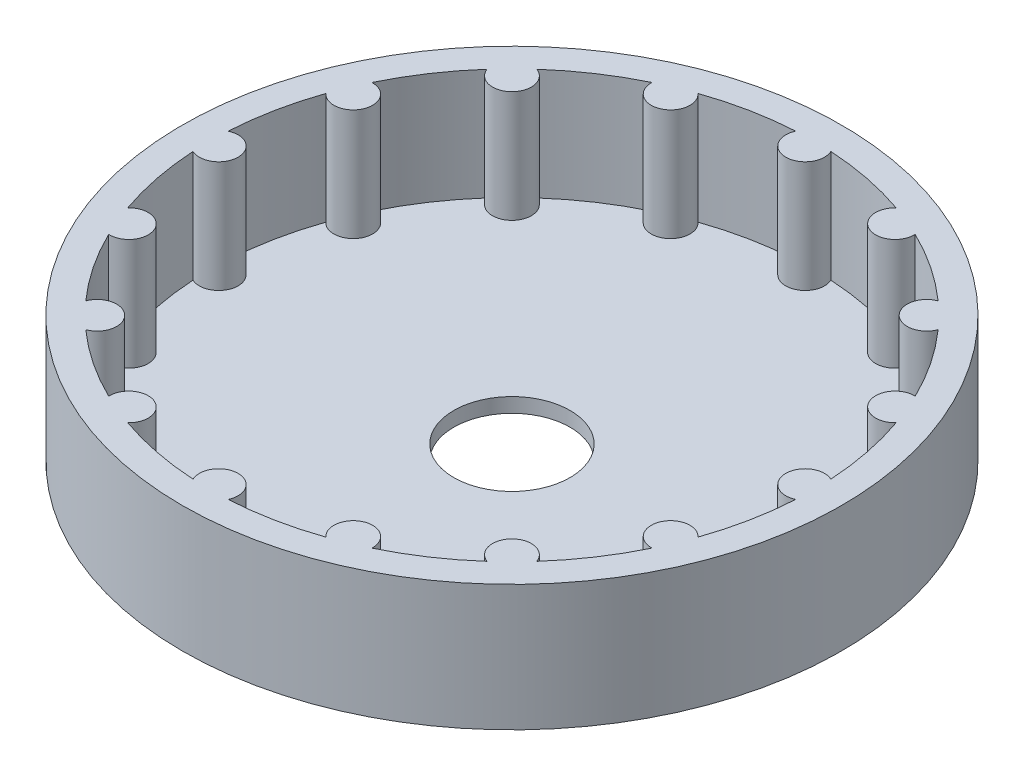
ISO-10303-21;
HEADER;
FILE_DESCRIPTION(('STEP AP214'),'2;1');
FILE_NAME('part.step','',(''),(''),'','','');
FILE_SCHEMA(('AUTOMOTIVE_DESIGN { 1 0 10303 214 1 1 1 1 }'));
ENDSEC;
DATA;
#1=APPLICATION_CONTEXT('core data for automotive mechanical design processes');
#2=APPLICATION_PROTOCOL_DEFINITION('international standard','automotive_design',2000,#1);
#3=PRODUCT_CONTEXT('',#1,'mechanical');
#4=PRODUCT('Part','Part','',(#3));
#5=PRODUCT_RELATED_PRODUCT_CATEGORY('part','',(#4));
#6=PRODUCT_DEFINITION_FORMATION('','',#4);
#7=PRODUCT_DEFINITION_CONTEXT('part definition',#1,'design');
#8=PRODUCT_DEFINITION('design','',#6,#7);
#9=PRODUCT_DEFINITION_SHAPE('','',#8);
#10=(LENGTH_UNIT() NAMED_UNIT(*) SI_UNIT(.MILLI.,.METRE.));
#11=(NAMED_UNIT(*) PLANE_ANGLE_UNIT() SI_UNIT($,.RADIAN.));
#12=(NAMED_UNIT(*) SI_UNIT($,.STERADIAN.) SOLID_ANGLE_UNIT());
#13=UNCERTAINTY_MEASURE_WITH_UNIT(LENGTH_MEASURE(1.E-05),#10,'distance_accuracy_value','');
#14=(GEOMETRIC_REPRESENTATION_CONTEXT(3) GLOBAL_UNCERTAINTY_ASSIGNED_CONTEXT((#13)) GLOBAL_UNIT_ASSIGNED_CONTEXT((#10,
#11,#12)) REPRESENTATION_CONTEXT('',''));
#15=CARTESIAN_POINT('',(0.,0.,0.));
#16=DIRECTION('',(0.,0.,1.));
#17=DIRECTION('',(1.,0.,0.));
#18=AXIS2_PLACEMENT_3D('',#15,#16,#17);
#19=CARTESIAN_POINT('',(0.,23.,-60.5));
#20=DIRECTION('',(0.,-1.,0.));
#21=DIRECTION('',(0.,0.,-1.));
#22=AXIS2_PLACEMENT_3D('',#19,#20,#21);
#23=CYLINDRICAL_SURFACE('',#22,4.);
#24=CARTESIAN_POINT('',(0.,0.,-60.5));
#25=DIRECTION('',(0.,1.,0.));
#26=DIRECTION('',(0.,0.,1.));
#27=AXIS2_PLACEMENT_3D('',#24,#25,#26);
#28=CIRCLE('',#27,4.);
#29=CARTESIAN_POINT('',(-3.63159136046996,0.,-62.1767659915921));
#30=VERTEX_POINT('',#29);
#31=CARTESIAN_POINT('',(3.63159136046996,0.,-62.1767659915921));
#32=VERTEX_POINT('',#31);
#33=EDGE_CURVE('E585',#30,#32,#28,.T.);
#34=ORIENTED_EDGE('',*,*,#33,.T.);
#35=DIRECTION('',(0.,-1.,0.));
#36=VECTOR('',#35,1.);
#37=CARTESIAN_POINT('',(3.63159136046996,23.,-62.1767659915921));
#38=LINE('',#37,#36);
#39=CARTESIAN_POINT('',(3.63159136046996,23.,-62.1767659915921));
#40=VERTEX_POINT('',#39);
#41=EDGE_CURVE('E12',#40,#32,#38,.T.);
#42=ORIENTED_EDGE('',*,*,#41,.F.);
#43=CARTESIAN_POINT('',(0.,23.,-60.5));
#44=DIRECTION('',(0.,1.,0.));
#45=DIRECTION('',(0.,0.,1.));
#46=AXIS2_PLACEMENT_3D('',#43,#44,#45);
#47=CIRCLE('',#46,4.);
#48=CARTESIAN_POINT('',(-3.63159136046996,23.,-62.1767659915921));
#49=VERTEX_POINT('',#48);
#50=EDGE_CURVE('E581',#49,#40,#47,.T.);
#51=ORIENTED_EDGE('',*,*,#50,.F.);
#52=DIRECTION('',(0.,-1.,0.));
#53=VECTOR('',#52,1.);
#54=CARTESIAN_POINT('',(-3.63159136046996,23.,-62.1767659915921));
#55=LINE('',#54,#53);
#56=EDGE_CURVE('E178',#49,#30,#55,.T.);
#57=ORIENTED_EDGE('',*,*,#56,.T.);
#58=EDGE_LOOP('',(#34,#42,#51,#57));
#59=FACE_BOUND('',#58,.T.);
#60=ADVANCED_FACE('F167',(#59),#23,.T.);
#61=CARTESIAN_POINT('',(0.,23.,0.));
#62=DIRECTION('',(0.,1.,0.));
#63=DIRECTION('',(0.,0.,1.));
#64=AXIS2_PLACEMENT_3D('',#61,#62,#63);
#65=PLANE('',#64);
#66=ORIENTED_EDGE('',*,*,#50,.T.);
#67=CARTESIAN_POINT('',(0.,23.,0.));
#68=DIRECTION('',(0.,1.,0.));
#69=DIRECTION('',(0.,0.,1.));
#70=AXIS2_PLACEMENT_3D('',#67,#68,#69);
#71=CIRCLE('',#70,62.2827318362213);
#72=CARTESIAN_POINT('',(20.4388652946379,23.,-58.8335913441488));
#73=VERTEX_POINT('',#72);
#74=EDGE_CURVE('E621',#73,#40,#71,.T.);
#75=ORIENTED_EDGE('',*,*,#74,.F.);
#76=CARTESIAN_POINT('',(23.1523476580888,23.,-55.8947117169375));
#77=DIRECTION('',(0.,1.,0.));
#78=DIRECTION('',(0.,0.,1.));
#79=AXIS2_PLACEMENT_3D('',#76,#77,#78);
#80=CIRCLE('',#79,3.99999999999961);
#81=CARTESIAN_POINT('',(27.1491711514072,23.,-56.0540916506034));
#82=VERTEX_POINT('',#81);
#83=EDGE_CURVE('E557',#73,#82,#80,.T.);
#84=ORIENTED_EDGE('',*,*,#83,.T.);
#85=CARTESIAN_POINT('',(41.3976899874106,23.,-46.5335357423965));
#86=VERTEX_POINT('',#85);
#87=EDGE_CURVE('E617',#86,#82,#71,.T.);
#88=ORIENTED_EDGE('',*,*,#87,.F.);
#89=CARTESIAN_POINT('',(42.7799602617896,23.,-42.7799602617946));
#90=DIRECTION('',(0.,1.,0.));
#91=DIRECTION('',(0.,0.,1.));
#92=AXIS2_PLACEMENT_3D('',#89,#90,#91);
#93=CIRCLE('',#92,4.00000000000098);
#94=CARTESIAN_POINT('',(46.5335357423917,23.,-41.397689987416));
#95=VERTEX_POINT('',#94);
#96=EDGE_CURVE('E550',#86,#95,#93,.T.);
#97=ORIENTED_EDGE('',*,*,#96,.T.);
#98=CARTESIAN_POINT('',(56.0540916505962,23.,-27.1491711514222));
#99=VERTEX_POINT('',#98);
#100=EDGE_CURVE('E612',#99,#95,#71,.T.);
#101=ORIENTED_EDGE('',*,*,#100,.F.);
#102=CARTESIAN_POINT('',(55.8947117169403,23.,-23.152347658099));
#103=DIRECTION('',(0.,1.,0.));
#104=DIRECTION('',(0.,0.,1.));
#105=AXIS2_PLACEMENT_3D('',#102,#103,#104);
#106=CIRCLE('',#105,4.00000000000401);
#107=CARTESIAN_POINT('',(58.8335913441486,23.,-20.4388652946384));
#108=VERTEX_POINT('',#107);
#109=EDGE_CURVE('E542',#99,#108,#106,.T.);
#110=ORIENTED_EDGE('',*,*,#109,.T.);
#111=CARTESIAN_POINT('',(62.1767659915905,23.,-3.63159136049729));
#112=VERTEX_POINT('',#111);
#113=EDGE_CURVE('E607',#112,#108,#71,.T.);
#114=ORIENTED_EDGE('',*,*,#113,.F.);
#115=CARTESIAN_POINT('',(60.500000000012,23.,-1.20254802740738E-11));
#116=DIRECTION('',(0.,1.,0.));
#117=DIRECTION('',(0.,0.,1.));
#118=AXIS2_PLACEMENT_3D('',#115,#116,#117);
#119=CIRCLE('',#118,4.00000000000819);
#120=CARTESIAN_POINT('',(62.176765991592,23.,3.63159136047257));
#121=VERTEX_POINT('',#120);
#122=EDGE_CURVE('E534',#112,#121,#119,.T.);
#123=ORIENTED_EDGE('',*,*,#122,.T.);
#124=CARTESIAN_POINT('',(58.83359134416,23.,20.4388652946055));
#125=VERTEX_POINT('',#124);
#126=EDGE_CURVE('E602',#125,#121,#71,.T.);
#127=ORIENTED_EDGE('',*,*,#126,.F.);
#128=CARTESIAN_POINT('',(55.8947117169495,23.,23.1523476580768));
#129=DIRECTION('',(0.,1.,0.));
#130=DIRECTION('',(0.,0.,1.));
#131=AXIS2_PLACEMENT_3D('',#128,#129,#130);
#132=CIRCLE('',#131,4.00000000001291);
#133=CARTESIAN_POINT('',(56.0540916506025,23.,27.149171151409));
#134=VERTEX_POINT('',#133);
#135=EDGE_CURVE('E526',#125,#134,#132,.T.);
#136=ORIENTED_EDGE('',*,*,#135,.T.);
#137=CARTESIAN_POINT('',(46.5335357424206,23.,41.3976899873835));
#138=VERTEX_POINT('',#137);
#139=EDGE_CURVE('E597',#138,#134,#71,.T.);
#140=ORIENTED_EDGE('',*,*,#139,.F.);
#141=CARTESIAN_POINT('',(42.7799602618067,23.,42.7799602617776));
#142=DIRECTION('',(0.,1.,0.));
#143=DIRECTION('',(0.,0.,1.));
#144=AXIS2_PLACEMENT_3D('',#141,#142,#143);
#145=CIRCLE('',#144,4.00000000001745);
#146=CARTESIAN_POINT('',(41.3976899874151,23.,46.5335357423925));
#147=VERTEX_POINT('',#146);
#148=EDGE_CURVE('E397',#138,#147,#145,.T.);
#149=ORIENTED_EDGE('',*,*,#148,.T.);
#150=CARTESIAN_POINT('',(27.1491711514514,23.,56.054091650582));
#151=VERTEX_POINT('',#150);
#152=EDGE_CURVE('E423',#151,#147,#71,.T.);
#153=ORIENTED_EDGE('',*,*,#152,.F.);
#154=CARTESIAN_POINT('',(23.1523476581111,23.,55.8947117169282));
#155=DIRECTION('',(0.,1.,0.));
#156=DIRECTION('',(0.,0.,1.));
#157=AXIS2_PLACEMENT_3D('',#154,#155,#156);
#158=CIRCLE('',#157,4.00000000002112);
#159=CARTESIAN_POINT('',(20.4388652946383,23.,58.8335913441486));
#160=VERTEX_POINT('',#159);
#161=EDGE_CURVE('E396',#151,#160,#158,.T.);
#162=ORIENTED_EDGE('',*,*,#161,.T.);
#163=CARTESIAN_POINT('',(3.63159136052117,23.,62.1767659915891));
#164=VERTEX_POINT('',#163);
#165=EDGE_CURVE('E385',#164,#160,#71,.T.);
#166=ORIENTED_EDGE('',*,*,#165,.F.);
#167=CARTESIAN_POINT('',(2.40509605481477E-11,23.,60.5));
#168=DIRECTION('',(0.,1.,0.));
#169=DIRECTION('',(0.,0.,1.));
#170=AXIS2_PLACEMENT_3D('',#167,#168,#169);
#171=CIRCLE('',#170,4.00000000002341);
#172=CARTESIAN_POINT('',(-3.63159136047173,23.,62.176765991592));
#173=VERTEX_POINT('',#172);
#174=EDGE_CURVE('E506',#164,#173,#171,.T.);
#175=ORIENTED_EDGE('',*,*,#174,.T.);
#176=CARTESIAN_POINT('',(-20.4388652945944,23.,58.8335913441639));
#177=VERTEX_POINT('',#176);
#178=EDGE_CURVE('E421',#177,#173,#71,.T.);
#179=ORIENTED_EDGE('',*,*,#178,.F.);
#180=CARTESIAN_POINT('',(-23.1523476580648,23.,55.8947117169375));
#181=DIRECTION('',(0.,1.,0.));
#182=DIRECTION('',(0.,0.,1.));
#183=AXIS2_PLACEMENT_3D('',#180,#181,#182);
#184=CIRCLE('',#183,4.00000000002393);
#185=CARTESIAN_POINT('',(-27.1491711514075,23.,56.0540916506033));
#186=VERTEX_POINT('',#185);
#187=EDGE_CURVE('E505',#177,#186,#184,.T.);
#188=ORIENTED_EDGE('',*,*,#187,.T.);
#189=CARTESIAN_POINT('',(-41.3976899873852,23.,46.5335357424191));
#190=VERTEX_POINT('',#189);
#191=EDGE_CURVE('E495',#190,#186,#71,.T.);
#192=ORIENTED_EDGE('',*,*,#191,.F.);
#193=CARTESIAN_POINT('',(-42.7799602617656,23.,42.7799602617946));
#194=DIRECTION('',(0.,1.,0.));
#195=DIRECTION('',(0.,0.,1.));
#196=AXIS2_PLACEMENT_3D('',#193,#194,#195);
#197=CIRCLE('',#196,4.00000000002262);
#198=CARTESIAN_POINT('',(-46.533535742391,23.,41.3976899874168));
#199=VERTEX_POINT('',#198);
#200=EDGE_CURVE('E706',#190,#199,#197,.T.);
#201=ORIENTED_EDGE('',*,*,#200,.T.);
#202=CARTESIAN_POINT('',(-56.0540916505888,23.,27.1491711514373));
#203=VERTEX_POINT('',#202);
#204=EDGE_CURVE('E646',#203,#199,#71,.T.);
#205=ORIENTED_EDGE('',*,*,#204,.F.);
#206=CARTESIAN_POINT('',(-55.8947117169162,23.,23.1523476580991));
#207=DIRECTION('',(0.,1.,0.));
#208=DIRECTION('',(0.,0.,1.));
#209=AXIS2_PLACEMENT_3D('',#206,#207,#208);
#210=CIRCLE('',#209,4.00000000001976);
#211=CARTESIAN_POINT('',(-58.8335913441479,23.,20.4388652946405));
#212=VERTEX_POINT('',#211);
#213=EDGE_CURVE('E698',#203,#212,#210,.T.);
#214=ORIENTED_EDGE('',*,*,#213,.T.);
#215=CARTESIAN_POINT('',(-62.1767659915907,23.,3.63159136049431));
#216=VERTEX_POINT('',#215);
#217=EDGE_CURVE('E641',#216,#212,#71,.T.);
#218=ORIENTED_EDGE('',*,*,#217,.F.);
#219=CARTESIAN_POINT('',(-60.499999999988,23.,1.20328893872087E-11));
#220=DIRECTION('',(0.,1.,0.));
#221=DIRECTION('',(0.,0.,1.));
#222=AXIS2_PLACEMENT_3D('',#219,#220,#221);
#223=CIRCLE('',#222,4.00000000001563);
#224=CARTESIAN_POINT('',(-62.1767659915921,23.,-3.63159136046958));
#225=VERTEX_POINT('',#224);
#226=EDGE_CURVE('E690',#216,#225,#223,.T.);
#227=ORIENTED_EDGE('',*,*,#226,.T.);
#228=CARTESIAN_POINT('',(-58.8335913441527,23.,-20.4388652946265));
#229=VERTEX_POINT('',#228);
#230=EDGE_CURVE('E636',#229,#225,#71,.T.);
#231=ORIENTED_EDGE('',*,*,#230,.F.);
#232=CARTESIAN_POINT('',(-55.8947117169254,23.,-23.1523476580768));
#233=DIRECTION('',(0.,1.,0.));
#234=DIRECTION('',(0.,0.,1.));
#235=AXIS2_PLACEMENT_3D('',#232,#233,#234);
#236=CIRCLE('',#235,4.00000000001096);
#237=CARTESIAN_POINT('',(-56.054091650604,23.,-27.1491711514061));
#238=VERTEX_POINT('',#237);
#239=EDGE_CURVE('E682',#229,#238,#236,.T.);
#240=ORIENTED_EDGE('',*,*,#239,.T.);
#241=CARTESIAN_POINT('',(-46.5335357423954,23.,-41.3976899874119));
#242=VERTEX_POINT('',#241);
#243=EDGE_CURVE('E631',#242,#238,#71,.T.);
#244=ORIENTED_EDGE('',*,*,#243,.F.);
#245=CARTESIAN_POINT('',(-42.7799602617826,23.,-42.7799602617776));
#246=DIRECTION('',(0.,1.,0.));
#247=DIRECTION('',(0.,0.,1.));
#248=AXIS2_PLACEMENT_3D('',#245,#246,#247);
#249=CIRCLE('',#248,4.00000000000657);
#250=CARTESIAN_POINT('',(-41.3976899874173,23.,-46.5335357423905));
#251=VERTEX_POINT('',#250);
#252=EDGE_CURVE('E674',#242,#251,#249,.T.);
#253=ORIENTED_EDGE('',*,*,#252,.T.);
#254=CARTESIAN_POINT('',(-27.1491711514085,23.,-56.0540916506028));
#255=VERTEX_POINT('',#254);
#256=EDGE_CURVE('E628',#255,#251,#71,.T.);
#257=ORIENTED_EDGE('',*,*,#256,.F.);
#258=CARTESIAN_POINT('',(-23.1523476580871,23.,-55.8947117169282));
#259=DIRECTION('',(0.,1.,0.));
#260=DIRECTION('',(0.,0.,1.));
#261=AXIS2_PLACEMENT_3D('',#258,#259,#260);
#262=CIRCLE('',#261,4.00000000000304);
#263=CARTESIAN_POINT('',(-20.4388652946402,23.,-58.833591344148));
#264=VERTEX_POINT('',#263);
#265=EDGE_CURVE('E406',#255,#264,#262,.T.);
#266=ORIENTED_EDGE('',*,*,#265,.T.);
#267=EDGE_CURVE('E625',#49,#264,#71,.T.);
#268=ORIENTED_EDGE('',*,*,#267,.F.);
#269=EDGE_LOOP('',(#66,#75,#84,#88,#97,#101,#110,#114,#123,#127,#136,#140,#149,#153,#162,#166,
#175,#179,#188,#192,#201,#205,#214,#218,#227,#231,#240,#244,#253,#257,#266,#268));
#270=FACE_BOUND('',#269,.T.);
#271=CARTESIAN_POINT('',(0.,23.,0.));
#272=DIRECTION('',(0.,1.,0.));
#273=DIRECTION('',(0.,0.,1.));
#274=AXIS2_PLACEMENT_3D('',#271,#272,#273);
#275=CIRCLE('',#274,68.);
#276=CARTESIAN_POINT('',(0.,23.,68.));
#277=VERTEX_POINT('',#276);
#278=EDGE_CURVE('E388',#277,#277,#275,.T.);
#279=ORIENTED_EDGE('',*,*,#278,.T.);
#280=EDGE_LOOP('',(#279));
#281=FACE_BOUND('',#280,.T.);
#282=ADVANCED_FACE('F660',(#270,#281),#65,.T.);
#283=CARTESIAN_POINT('',(-23.1523476580648,23.,55.8947117169375));
#284=DIRECTION('',(0.,-1.,0.));
#285=DIRECTION('',(0.,0.,-1.));
#286=AXIS2_PLACEMENT_3D('',#283,#284,#285);
#287=CYLINDRICAL_SURFACE('',#286,4.00000000002393);
#288=ORIENTED_EDGE('',*,*,#187,.F.);
#289=DIRECTION('',(0.,-1.,0.));
#290=VECTOR('',#289,1.);
#291=CARTESIAN_POINT('',(-20.4388652945944,23.,58.8335913441639));
#292=LINE('',#291,#290);
#293=CARTESIAN_POINT('',(-20.4388652945944,0.,58.8335913441639));
#294=VERTEX_POINT('',#293);
#295=EDGE_CURVE('E500',#177,#294,#292,.T.);
#296=ORIENTED_EDGE('',*,*,#295,.T.);
#297=CARTESIAN_POINT('',(-23.1523476580648,0.,55.8947117169375));
#298=DIRECTION('',(0.,1.,0.));
#299=DIRECTION('',(0.,0.,1.));
#300=AXIS2_PLACEMENT_3D('',#297,#298,#299);
#301=CIRCLE('',#300,4.00000000002393);
#302=CARTESIAN_POINT('',(-27.1491711514075,0.,56.0540916506033));
#303=VERTEX_POINT('',#302);
#304=EDGE_CURVE('E485',#294,#303,#301,.T.);
#305=ORIENTED_EDGE('',*,*,#304,.T.);
#306=DIRECTION('',(0.,-1.,0.));
#307=VECTOR('',#306,1.);
#308=CARTESIAN_POINT('',(-27.1491711514075,23.,56.0540916506033));
#309=LINE('',#308,#307);
#310=EDGE_CURVE('E493',#186,#303,#309,.T.);
#311=ORIENTED_EDGE('',*,*,#310,.F.);
#312=EDGE_LOOP('',(#288,#296,#305,#311));
#313=FACE_BOUND('',#312,.T.);
#314=ADVANCED_FACE('F502',(#313),#287,.T.);
#315=CARTESIAN_POINT('',(-42.7799602617656,23.,42.7799602617946));
#316=DIRECTION('',(0.,-1.,0.));
#317=DIRECTION('',(0.,0.,-1.));
#318=AXIS2_PLACEMENT_3D('',#315,#316,#317);
#319=CYLINDRICAL_SURFACE('',#318,4.00000000002262);
#320=ORIENTED_EDGE('',*,*,#200,.F.);
#321=DIRECTION('',(0.,-1.,0.));
#322=VECTOR('',#321,1.);
#323=CARTESIAN_POINT('',(-41.3976899873852,23.,46.5335357424191));
#324=LINE('',#323,#322);
#325=CARTESIAN_POINT('',(-41.3976899873852,0.,46.5335357424191));
#326=VERTEX_POINT('',#325);
#327=EDGE_CURVE('E491',#190,#326,#324,.T.);
#328=ORIENTED_EDGE('',*,*,#327,.T.);
#329=CARTESIAN_POINT('',(-42.7799602617656,0.,42.7799602617946));
#330=DIRECTION('',(0.,1.,0.));
#331=DIRECTION('',(0.,0.,1.));
#332=AXIS2_PLACEMENT_3D('',#329,#330,#331);
#333=CIRCLE('',#332,4.00000000002262);
#334=CARTESIAN_POINT('',(-46.533535742391,0.,41.3976899874168));
#335=VERTEX_POINT('',#334);
#336=EDGE_CURVE('E487',#326,#335,#333,.T.);
#337=ORIENTED_EDGE('',*,*,#336,.T.);
#338=DIRECTION('',(0.,-1.,0.));
#339=VECTOR('',#338,1.);
#340=CARTESIAN_POINT('',(-46.533535742391,23.,41.3976899874168));
#341=LINE('',#340,#339);
#342=EDGE_CURVE('E712',#199,#335,#341,.T.);
#343=ORIENTED_EDGE('',*,*,#342,.F.);
#344=EDGE_LOOP('',(#320,#328,#337,#343));
#345=FACE_BOUND('',#344,.T.);
#346=ADVANCED_FACE('F711',(#345),#319,.T.);
#347=CARTESIAN_POINT('',(-55.8947117169162,23.,23.1523476580991));
#348=DIRECTION('',(0.,-1.,0.));
#349=DIRECTION('',(0.,0.,-1.));
#350=AXIS2_PLACEMENT_3D('',#347,#348,#349);
#351=CYLINDRICAL_SURFACE('',#350,4.00000000001976);
#352=ORIENTED_EDGE('',*,*,#213,.F.);
#353=DIRECTION('',(0.,-1.,0.));
#354=VECTOR('',#353,1.);
#355=CARTESIAN_POINT('',(-56.0540916505888,23.,27.1491711514373));
#356=LINE('',#355,#354);
#357=CARTESIAN_POINT('',(-56.0540916505888,0.,27.1491711514373));
#358=VERTEX_POINT('',#357);
#359=EDGE_CURVE('E716',#203,#358,#356,.T.);
#360=ORIENTED_EDGE('',*,*,#359,.T.);
#361=CARTESIAN_POINT('',(-55.8947117169162,0.,23.1523476580991));
#362=DIRECTION('',(0.,1.,0.));
#363=DIRECTION('',(0.,0.,1.));
#364=AXIS2_PLACEMENT_3D('',#361,#362,#363);
#365=CIRCLE('',#364,4.00000000001976);
#366=CARTESIAN_POINT('',(-58.8335913441479,0.,20.4388652946405));
#367=VERTEX_POINT('',#366);
#368=EDGE_CURVE('E702',#358,#367,#365,.T.);
#369=ORIENTED_EDGE('',*,*,#368,.T.);
#370=DIRECTION('',(0.,-1.,0.));
#371=VECTOR('',#370,1.);
#372=CARTESIAN_POINT('',(-58.8335913441479,23.,20.4388652946405));
#373=LINE('',#372,#371);
#374=EDGE_CURVE('E721',#212,#367,#373,.T.);
#375=ORIENTED_EDGE('',*,*,#374,.F.);
#376=EDGE_LOOP('',(#352,#360,#369,#375));
#377=FACE_BOUND('',#376,.T.);
#378=ADVANCED_FACE('F870',(#377),#351,.T.);
#379=CARTESIAN_POINT('',(-60.499999999988,23.,1.20328893872087E-11));
#380=DIRECTION('',(0.,-1.,0.));
#381=DIRECTION('',(0.,0.,-1.));
#382=AXIS2_PLACEMENT_3D('',#379,#380,#381);
#383=CYLINDRICAL_SURFACE('',#382,4.00000000001563);
#384=ORIENTED_EDGE('',*,*,#226,.F.);
#385=DIRECTION('',(0.,-1.,0.));
#386=VECTOR('',#385,1.);
#387=CARTESIAN_POINT('',(-62.1767659915907,23.,3.63159136049431));
#388=LINE('',#387,#386);
#389=CARTESIAN_POINT('',(-62.1767659915907,0.,3.63159136049431));
#390=VERTEX_POINT('',#389);
#391=EDGE_CURVE('E724',#216,#390,#388,.T.);
#392=ORIENTED_EDGE('',*,*,#391,.T.);
#393=CARTESIAN_POINT('',(-60.499999999988,0.,1.20328893872087E-11));
#394=DIRECTION('',(0.,1.,0.));
#395=DIRECTION('',(0.,0.,1.));
#396=AXIS2_PLACEMENT_3D('',#393,#394,#395);
#397=CIRCLE('',#396,4.00000000001563);
#398=CARTESIAN_POINT('',(-62.1767659915921,0.,-3.63159136046958));
#399=VERTEX_POINT('',#398);
#400=EDGE_CURVE('E694',#390,#399,#397,.T.);
#401=ORIENTED_EDGE('',*,*,#400,.T.);
#402=DIRECTION('',(0.,-1.,0.));
#403=VECTOR('',#402,1.);
#404=CARTESIAN_POINT('',(-62.1767659915921,23.,-3.63159136046958));
#405=LINE('',#404,#403);
#406=EDGE_CURVE('E727',#225,#399,#405,.T.);
#407=ORIENTED_EDGE('',*,*,#406,.F.);
#408=EDGE_LOOP('',(#384,#392,#401,#407));
#409=FACE_BOUND('',#408,.T.);
#410=ADVANCED_FACE('F863',(#409),#383,.T.);
#411=CARTESIAN_POINT('',(-55.8947117169254,23.,-23.1523476580768));
#412=DIRECTION('',(0.,-1.,0.));
#413=DIRECTION('',(0.,0.,-1.));
#414=AXIS2_PLACEMENT_3D('',#411,#412,#413);
#415=CYLINDRICAL_SURFACE('',#414,4.00000000001096);
#416=ORIENTED_EDGE('',*,*,#239,.F.);
#417=DIRECTION('',(0.,-1.,0.));
#418=VECTOR('',#417,1.);
#419=CARTESIAN_POINT('',(-58.8335913441527,23.,-20.4388652946265));
#420=LINE('',#419,#418);
#421=CARTESIAN_POINT('',(-58.8335913441527,0.,-20.4388652946265));
#422=VERTEX_POINT('',#421);
#423=EDGE_CURVE('E730',#229,#422,#420,.T.);
#424=ORIENTED_EDGE('',*,*,#423,.T.);
#425=CARTESIAN_POINT('',(-55.8947117169254,0.,-23.1523476580768));
#426=DIRECTION('',(0.,1.,0.));
#427=DIRECTION('',(0.,0.,1.));
#428=AXIS2_PLACEMENT_3D('',#425,#426,#427);
#429=CIRCLE('',#428,4.00000000001096);
#430=CARTESIAN_POINT('',(-56.054091650604,0.,-27.1491711514061));
#431=VERTEX_POINT('',#430);
#432=EDGE_CURVE('E686',#422,#431,#429,.T.);
#433=ORIENTED_EDGE('',*,*,#432,.T.);
#434=DIRECTION('',(0.,-1.,0.));
#435=VECTOR('',#434,1.);
#436=CARTESIAN_POINT('',(-56.054091650604,23.,-27.1491711514061));
#437=LINE('',#436,#435);
#438=EDGE_CURVE('E733',#238,#431,#437,.T.);
#439=ORIENTED_EDGE('',*,*,#438,.F.);
#440=EDGE_LOOP('',(#416,#424,#433,#439));
#441=FACE_BOUND('',#440,.T.);
#442=ADVANCED_FACE('F857',(#441),#415,.T.);
#443=CARTESIAN_POINT('',(-42.7799602617826,23.,-42.7799602617776));
#444=DIRECTION('',(0.,-1.,0.));
#445=DIRECTION('',(0.,0.,-1.));
#446=AXIS2_PLACEMENT_3D('',#443,#444,#445);
#447=CYLINDRICAL_SURFACE('',#446,4.00000000000657);
#448=ORIENTED_EDGE('',*,*,#252,.F.);
#449=DIRECTION('',(0.,-1.,0.));
#450=VECTOR('',#449,1.);
#451=CARTESIAN_POINT('',(-46.5335357423954,23.,-41.3976899874119));
#452=LINE('',#451,#450);
#453=CARTESIAN_POINT('',(-46.5335357423954,0.,-41.3976899874119));
#454=VERTEX_POINT('',#453);
#455=EDGE_CURVE('E736',#242,#454,#452,.T.);
#456=ORIENTED_EDGE('',*,*,#455,.T.);
#457=CARTESIAN_POINT('',(-42.7799602617826,0.,-42.7799602617776));
#458=DIRECTION('',(0.,1.,0.));
#459=DIRECTION('',(0.,0.,1.));
#460=AXIS2_PLACEMENT_3D('',#457,#458,#459);
#461=CIRCLE('',#460,4.00000000000657);
#462=CARTESIAN_POINT('',(-41.3976899874173,0.,-46.5335357423905));
#463=VERTEX_POINT('',#462);
#464=EDGE_CURVE('E678',#454,#463,#461,.T.);
#465=ORIENTED_EDGE('',*,*,#464,.T.);
#466=DIRECTION('',(0.,-1.,0.));
#467=VECTOR('',#466,1.);
#468=CARTESIAN_POINT('',(-41.3976899874173,23.,-46.5335357423905));
#469=LINE('',#468,#467);
#470=EDGE_CURVE('E739',#251,#463,#469,.T.);
#471=ORIENTED_EDGE('',*,*,#470,.F.);
#472=EDGE_LOOP('',(#448,#456,#465,#471));
#473=FACE_BOUND('',#472,.T.);
#474=ADVANCED_FACE('F853',(#473),#447,.T.);
#475=CARTESIAN_POINT('',(42.7799602617896,23.,-42.7799602617946));
#476=DIRECTION('',(0.,-1.,0.));
#477=DIRECTION('',(0.,0.,-1.));
#478=AXIS2_PLACEMENT_3D('',#475,#476,#477);
#479=CYLINDRICAL_SURFACE('',#478,4.00000000000098);
#480=ORIENTED_EDGE('',*,*,#96,.F.);
#481=DIRECTION('',(0.,-1.,0.));
#482=VECTOR('',#481,1.);
#483=CARTESIAN_POINT('',(41.3976899874106,23.,-46.5335357423965));
#484=LINE('',#483,#482);
#485=CARTESIAN_POINT('',(41.3976899874106,0.,-46.5335357423965));
#486=VERTEX_POINT('',#485);
#487=EDGE_CURVE('E754',#86,#486,#484,.T.);
#488=ORIENTED_EDGE('',*,*,#487,.T.);
#489=CARTESIAN_POINT('',(42.7799602617896,0.,-42.7799602617946));
#490=DIRECTION('',(0.,1.,0.));
#491=DIRECTION('',(0.,0.,1.));
#492=AXIS2_PLACEMENT_3D('',#489,#490,#491);
#493=CIRCLE('',#492,4.00000000000098);
#494=CARTESIAN_POINT('',(46.5335357423917,0.,-41.397689987416));
#495=VERTEX_POINT('',#494);
#496=EDGE_CURVE('E554',#486,#495,#493,.T.);
#497=ORIENTED_EDGE('',*,*,#496,.T.);
#498=DIRECTION('',(0.,-1.,0.));
#499=VECTOR('',#498,1.);
#500=CARTESIAN_POINT('',(46.5335357423917,23.,-41.397689987416));
#501=LINE('',#500,#499);
#502=EDGE_CURVE('E757',#95,#495,#501,.T.);
#503=ORIENTED_EDGE('',*,*,#502,.F.);
#504=EDGE_LOOP('',(#480,#488,#497,#503));
#505=FACE_BOUND('',#504,.T.);
#506=ADVANCED_FACE('F804',(#505),#479,.T.);
#507=CARTESIAN_POINT('',(55.8947117169403,23.,-23.152347658099));
#508=DIRECTION('',(0.,-1.,0.));
#509=DIRECTION('',(0.,0.,-1.));
#510=AXIS2_PLACEMENT_3D('',#507,#508,#509);
#511=CYLINDRICAL_SURFACE('',#510,4.00000000000401);
#512=ORIENTED_EDGE('',*,*,#109,.F.);
#513=DIRECTION('',(0.,-1.,0.));
#514=VECTOR('',#513,1.);
#515=CARTESIAN_POINT('',(56.0540916505962,23.,-27.1491711514222));
#516=LINE('',#515,#514);
#517=CARTESIAN_POINT('',(56.0540916505962,0.,-27.1491711514222));
#518=VERTEX_POINT('',#517);
#519=EDGE_CURVE('E760',#99,#518,#516,.T.);
#520=ORIENTED_EDGE('',*,*,#519,.T.);
#521=CARTESIAN_POINT('',(55.8947117169403,0.,-23.152347658099));
#522=DIRECTION('',(0.,1.,0.));
#523=DIRECTION('',(0.,0.,1.));
#524=AXIS2_PLACEMENT_3D('',#521,#522,#523);
#525=CIRCLE('',#524,4.00000000000401);
#526=CARTESIAN_POINT('',(58.8335913441486,0.,-20.4388652946384));
#527=VERTEX_POINT('',#526);
#528=EDGE_CURVE('E546',#518,#527,#525,.T.);
#529=ORIENTED_EDGE('',*,*,#528,.T.);
#530=DIRECTION('',(0.,-1.,0.));
#531=VECTOR('',#530,1.);
#532=CARTESIAN_POINT('',(58.8335913441486,23.,-20.4388652946384));
#533=LINE('',#532,#531);
#534=EDGE_CURVE('E763',#108,#527,#533,.T.);
#535=ORIENTED_EDGE('',*,*,#534,.F.);
#536=EDGE_LOOP('',(#512,#520,#529,#535));
#537=FACE_BOUND('',#536,.T.);
#538=ADVANCED_FACE('F800',(#537),#511,.T.);
#539=CARTESIAN_POINT('',(60.500000000012,23.,-1.20254802740738E-11));
#540=DIRECTION('',(0.,-1.,0.));
#541=DIRECTION('',(0.,0.,-1.));
#542=AXIS2_PLACEMENT_3D('',#539,#540,#541);
#543=CYLINDRICAL_SURFACE('',#542,4.00000000000819);
#544=ORIENTED_EDGE('',*,*,#122,.F.);
#545=DIRECTION('',(0.,-1.,0.));
#546=VECTOR('',#545,1.);
#547=CARTESIAN_POINT('',(62.1767659915905,23.,-3.63159136049729));
#548=LINE('',#547,#546);
#549=CARTESIAN_POINT('',(62.1767659915905,0.,-3.63159136049729));
#550=VERTEX_POINT('',#549);
#551=EDGE_CURVE('E766',#112,#550,#548,.T.);
#552=ORIENTED_EDGE('',*,*,#551,.T.);
#553=CARTESIAN_POINT('',(60.500000000012,0.,-1.20254802740738E-11));
#554=DIRECTION('',(0.,1.,0.));
#555=DIRECTION('',(0.,0.,1.));
#556=AXIS2_PLACEMENT_3D('',#553,#554,#555);
#557=CIRCLE('',#556,4.00000000000819);
#558=CARTESIAN_POINT('',(62.176765991592,0.,3.63159136047257));
#559=VERTEX_POINT('',#558);
#560=EDGE_CURVE('E538',#550,#559,#557,.T.);
#561=ORIENTED_EDGE('',*,*,#560,.T.);
#562=DIRECTION('',(0.,-1.,0.));
#563=VECTOR('',#562,1.);
#564=CARTESIAN_POINT('',(62.176765991592,23.,3.63159136047257));
#565=LINE('',#564,#563);
#566=EDGE_CURVE('E769',#121,#559,#565,.T.);
#567=ORIENTED_EDGE('',*,*,#566,.F.);
#568=EDGE_LOOP('',(#544,#552,#561,#567));
#569=FACE_BOUND('',#568,.T.);
#570=ADVANCED_FACE('F796',(#569),#543,.T.);
#571=CARTESIAN_POINT('',(55.8947117169495,23.,23.1523476580768));
#572=DIRECTION('',(0.,-1.,0.));
#573=DIRECTION('',(0.,0.,-1.));
#574=AXIS2_PLACEMENT_3D('',#571,#572,#573);
#575=CYLINDRICAL_SURFACE('',#574,4.00000000001291);
#576=ORIENTED_EDGE('',*,*,#135,.F.);
#577=DIRECTION('',(0.,-1.,0.));
#578=VECTOR('',#577,1.);
#579=CARTESIAN_POINT('',(58.83359134416,23.,20.4388652946055));
#580=LINE('',#579,#578);
#581=CARTESIAN_POINT('',(58.83359134416,0.,20.4388652946055));
#582=VERTEX_POINT('',#581);
#583=EDGE_CURVE('E772',#125,#582,#580,.T.);
#584=ORIENTED_EDGE('',*,*,#583,.T.);
#585=CARTESIAN_POINT('',(55.8947117169495,0.,23.1523476580768));
#586=DIRECTION('',(0.,1.,0.));
#587=DIRECTION('',(0.,0.,1.));
#588=AXIS2_PLACEMENT_3D('',#585,#586,#587);
#589=CIRCLE('',#588,4.00000000001291);
#590=CARTESIAN_POINT('',(56.0540916506025,0.,27.149171151409));
#591=VERTEX_POINT('',#590);
#592=EDGE_CURVE('E530',#582,#591,#589,.T.);
#593=ORIENTED_EDGE('',*,*,#592,.T.);
#594=DIRECTION('',(0.,-1.,0.));
#595=VECTOR('',#594,1.);
#596=CARTESIAN_POINT('',(56.0540916506025,23.,27.149171151409));
#597=LINE('',#596,#595);
#598=EDGE_CURVE('E775',#134,#591,#597,.T.);
#599=ORIENTED_EDGE('',*,*,#598,.F.);
#600=EDGE_LOOP('',(#576,#584,#593,#599));
#601=FACE_BOUND('',#600,.T.);
#602=ADVANCED_FACE('F792',(#601),#575,.T.);
#603=CARTESIAN_POINT('',(42.7799602618067,23.,42.7799602617776));
#604=DIRECTION('',(0.,-1.,0.));
#605=DIRECTION('',(0.,0.,-1.));
#606=AXIS2_PLACEMENT_3D('',#603,#604,#605);
#607=CYLINDRICAL_SURFACE('',#606,4.00000000001745);
#608=ORIENTED_EDGE('',*,*,#148,.F.);
#609=DIRECTION('',(0.,-1.,0.));
#610=VECTOR('',#609,1.);
#611=CARTESIAN_POINT('',(46.5335357424206,23.,41.3976899873835));
#612=LINE('',#611,#610);
#613=CARTESIAN_POINT('',(46.5335357424206,0.,41.3976899873835));
#614=VERTEX_POINT('',#613);
#615=EDGE_CURVE('E778',#138,#614,#612,.T.);
#616=ORIENTED_EDGE('',*,*,#615,.T.);
#617=CARTESIAN_POINT('',(42.7799602618067,0.,42.7799602617776));
#618=DIRECTION('',(0.,1.,0.));
#619=DIRECTION('',(0.,0.,1.));
#620=AXIS2_PLACEMENT_3D('',#617,#618,#619);
#621=CIRCLE('',#620,4.00000000001745);
#622=CARTESIAN_POINT('',(41.3976899874151,0.,46.5335357423925));
#623=VERTEX_POINT('',#622);
#624=EDGE_CURVE('E522',#614,#623,#621,.T.);
#625=ORIENTED_EDGE('',*,*,#624,.T.);
#626=DIRECTION('',(0.,-1.,0.));
#627=VECTOR('',#626,1.);
#628=CARTESIAN_POINT('',(41.3976899874151,23.,46.5335357423925));
#629=LINE('',#628,#627);
#630=EDGE_CURVE('E781',#147,#623,#629,.T.);
#631=ORIENTED_EDGE('',*,*,#630,.F.);
#632=EDGE_LOOP('',(#608,#616,#625,#631));
#633=FACE_BOUND('',#632,.T.);
#634=ADVANCED_FACE('F788',(#633),#607,.T.);
#635=CARTESIAN_POINT('',(23.1523476581111,23.,55.8947117169282));
#636=DIRECTION('',(0.,-1.,0.));
#637=DIRECTION('',(0.,0.,-1.));
#638=AXIS2_PLACEMENT_3D('',#635,#636,#637);
#639=CYLINDRICAL_SURFACE('',#638,4.00000000002112);
#640=DIRECTION('',(0.,-1.,0.));
#641=VECTOR('',#640,1.);
#642=CARTESIAN_POINT('',(20.4388652946383,23.,58.8335913441486));
#643=LINE('',#642,#641);
#644=CARTESIAN_POINT('',(20.4388652946383,0.,58.8335913441486));
#645=VERTEX_POINT('',#644);
#646=EDGE_CURVE('E379',#160,#645,#643,.T.);
#647=ORIENTED_EDGE('',*,*,#646,.F.);
#648=ORIENTED_EDGE('',*,*,#161,.F.);
#649=DIRECTION('',(0.,-1.,0.));
#650=VECTOR('',#649,1.);
#651=CARTESIAN_POINT('',(27.1491711514514,23.,56.054091650582));
#652=LINE('',#651,#650);
#653=CARTESIAN_POINT('',(27.1491711514514,0.,56.054091650582));
#654=VERTEX_POINT('',#653);
#655=EDGE_CURVE('E373',#151,#654,#652,.T.);
#656=ORIENTED_EDGE('',*,*,#655,.T.);
#657=CARTESIAN_POINT('',(23.1523476581111,0.,55.8947117169282));
#658=DIRECTION('',(0.,1.,0.));
#659=DIRECTION('',(0.,0.,1.));
#660=AXIS2_PLACEMENT_3D('',#657,#658,#659);
#661=CIRCLE('',#660,4.00000000002112);
#662=EDGE_CURVE('E391',#654,#645,#661,.T.);
#663=ORIENTED_EDGE('',*,*,#662,.T.);
#664=EDGE_LOOP('',(#647,#648,#656,#663));
#665=FACE_BOUND('',#664,.T.);
#666=ADVANCED_FACE('F392',(#665),#639,.T.);
#667=CARTESIAN_POINT('',(2.40509605481477E-11,23.,60.5));
#668=DIRECTION('',(0.,-1.,0.));
#669=DIRECTION('',(0.,0.,-1.));
#670=AXIS2_PLACEMENT_3D('',#667,#668,#669);
#671=CYLINDRICAL_SURFACE('',#670,4.00000000002341);
#672=ORIENTED_EDGE('',*,*,#174,.F.);
#673=DIRECTION('',(0.,-1.,0.));
#674=VECTOR('',#673,1.);
#675=CARTESIAN_POINT('',(3.63159136052117,23.,62.1767659915891));
#676=LINE('',#675,#674);
#677=CARTESIAN_POINT('',(3.63159136052117,0.,62.1767659915891));
#678=VERTEX_POINT('',#677);
#679=EDGE_CURVE('E589',#164,#678,#676,.T.);
#680=ORIENTED_EDGE('',*,*,#679,.T.);
#681=CARTESIAN_POINT('',(2.40509605481477E-11,0.,60.5));
#682=DIRECTION('',(0.,1.,0.));
#683=DIRECTION('',(0.,0.,1.));
#684=AXIS2_PLACEMENT_3D('',#681,#682,#683);
#685=CIRCLE('',#684,4.00000000002341);
#686=CARTESIAN_POINT('',(-3.63159136047173,0.,62.176765991592));
#687=VERTEX_POINT('',#686);
#688=EDGE_CURVE('E403',#678,#687,#685,.T.);
#689=ORIENTED_EDGE('',*,*,#688,.T.);
#690=DIRECTION('',(0.,-1.,0.));
#691=VECTOR('',#690,1.);
#692=CARTESIAN_POINT('',(-3.63159136047173,23.,62.176765991592));
#693=LINE('',#692,#691);
#694=EDGE_CURVE('E659',#173,#687,#693,.T.);
#695=ORIENTED_EDGE('',*,*,#694,.F.);
#696=EDGE_LOOP('',(#672,#680,#689,#695));
#697=FACE_BOUND('',#696,.T.);
#698=ADVANCED_FACE('F663',(#697),#671,.T.);
#699=CARTESIAN_POINT('',(0.,23.,0.));
#700=DIRECTION('',(0.,-1.,0.));
#701=DIRECTION('',(0.,0.,-1.));
#702=AXIS2_PLACEMENT_3D('',#699,#700,#701);
#703=CYLINDRICAL_SURFACE('',#702,68.);
#704=ORIENTED_EDGE('',*,*,#278,.F.);
#705=EDGE_LOOP('',(#704));
#706=FACE_BOUND('',#705,.T.);
#707=CARTESIAN_POINT('',(0.,-3.,0.));
#708=DIRECTION('',(0.,1.,0.));
#709=DIRECTION('',(0.,0.,1.));
#710=AXIS2_PLACEMENT_3D('',#707,#708,#709);
#711=CIRCLE('',#710,68.);
#712=CARTESIAN_POINT('',(0.,-3.,68.));
#713=VERTEX_POINT('',#712);
#714=EDGE_CURVE('E567',#713,#713,#711,.T.);
#715=ORIENTED_EDGE('',*,*,#714,.T.);
#716=EDGE_LOOP('',(#715));
#717=FACE_BOUND('',#716,.T.);
#718=ADVANCED_FACE('F830',(#706,#717),#703,.T.);
#719=CARTESIAN_POINT('',(0.,23.,0.));
#720=DIRECTION('',(0.,-1.,0.));
#721=DIRECTION('',(0.,0.,-1.));
#722=AXIS2_PLACEMENT_3D('',#719,#720,#721);
#723=CYLINDRICAL_SURFACE('',#722,62.2827318362213);
#724=CARTESIAN_POINT('',(0.,0.,0.));
#725=DIRECTION('',(0.,1.,0.));
#726=DIRECTION('',(0.,0.,1.));
#727=AXIS2_PLACEMENT_3D('',#724,#725,#726);
#728=CIRCLE('',#727,62.2827318362213);
#729=EDGE_CURVE('E405',#294,#687,#728,.T.);
#730=ORIENTED_EDGE('',*,*,#729,.F.);
#731=ORIENTED_EDGE('',*,*,#295,.F.);
#732=ORIENTED_EDGE('',*,*,#178,.T.);
#733=ORIENTED_EDGE('',*,*,#694,.T.);
#734=EDGE_LOOP('',(#730,#731,#732,#733));
#735=FACE_BOUND('',#734,.T.);
#736=ADVANCED_FACE('F658',(#735),#723,.F.);
#737=EDGE_CURVE('E411',#326,#303,#728,.T.);
#738=ORIENTED_EDGE('',*,*,#737,.F.);
#739=ORIENTED_EDGE('',*,*,#327,.F.);
#740=ORIENTED_EDGE('',*,*,#191,.T.);
#741=ORIENTED_EDGE('',*,*,#310,.T.);
#742=EDGE_LOOP('',(#738,#739,#740,#741));
#743=FACE_BOUND('',#742,.T.);
#744=ADVANCED_FACE('F489',(#743),#723,.F.);
#745=EDGE_CURVE('E474',#358,#335,#728,.T.);
#746=ORIENTED_EDGE('',*,*,#745,.F.);
#747=ORIENTED_EDGE('',*,*,#359,.F.);
#748=ORIENTED_EDGE('',*,*,#204,.T.);
#749=ORIENTED_EDGE('',*,*,#342,.T.);
#750=EDGE_LOOP('',(#746,#747,#748,#749));
#751=FACE_BOUND('',#750,.T.);
#752=ADVANCED_FACE('F988',(#751),#723,.F.);
#753=EDGE_CURVE('E469',#390,#367,#728,.T.);
#754=ORIENTED_EDGE('',*,*,#753,.F.);
#755=ORIENTED_EDGE('',*,*,#391,.F.);
#756=ORIENTED_EDGE('',*,*,#217,.T.);
#757=ORIENTED_EDGE('',*,*,#374,.T.);
#758=EDGE_LOOP('',(#754,#755,#756,#757));
#759=FACE_BOUND('',#758,.T.);
#760=ADVANCED_FACE('F996',(#759),#723,.F.);
#761=EDGE_CURVE('E464',#422,#399,#728,.T.);
#762=ORIENTED_EDGE('',*,*,#761,.F.);
#763=ORIENTED_EDGE('',*,*,#423,.F.);
#764=ORIENTED_EDGE('',*,*,#230,.T.);
#765=ORIENTED_EDGE('',*,*,#406,.T.);
#766=EDGE_LOOP('',(#762,#763,#764,#765));
#767=FACE_BOUND('',#766,.T.);
#768=ADVANCED_FACE('F1004',(#767),#723,.F.);
#769=EDGE_CURVE('E459',#454,#431,#728,.T.);
#770=ORIENTED_EDGE('',*,*,#769,.F.);
#771=ORIENTED_EDGE('',*,*,#455,.F.);
#772=ORIENTED_EDGE('',*,*,#243,.T.);
#773=ORIENTED_EDGE('',*,*,#438,.T.);
#774=EDGE_LOOP('',(#770,#771,#772,#773));
#775=FACE_BOUND('',#774,.T.);
#776=ADVANCED_FACE('F1012',(#775),#723,.F.);
#777=CARTESIAN_POINT('',(-27.1491711514085,0.,-56.0540916506028));
#778=VERTEX_POINT('',#777);
#779=EDGE_CURVE('E455',#778,#463,#728,.T.);
#780=ORIENTED_EDGE('',*,*,#779,.F.);
#781=DIRECTION('',(0.,-1.,0.));
#782=VECTOR('',#781,1.);
#783=CARTESIAN_POINT('',(-27.1491711514085,23.,-56.0540916506028));
#784=LINE('',#783,#782);
#785=EDGE_CURVE('E742',#255,#778,#784,.T.);
#786=ORIENTED_EDGE('',*,*,#785,.F.);
#787=ORIENTED_EDGE('',*,*,#256,.T.);
#788=ORIENTED_EDGE('',*,*,#470,.T.);
#789=EDGE_LOOP('',(#780,#786,#787,#788));
#790=FACE_BOUND('',#789,.T.);
#791=ADVANCED_FACE('F820',(#790),#723,.F.);
#792=CARTESIAN_POINT('',(27.1491711514072,0.,-56.0540916506034));
#793=VERTEX_POINT('',#792);
#794=EDGE_CURVE('E440',#486,#793,#728,.T.);
#795=ORIENTED_EDGE('',*,*,#794,.F.);
#796=ORIENTED_EDGE('',*,*,#487,.F.);
#797=ORIENTED_EDGE('',*,*,#87,.T.);
#798=DIRECTION('',(0.,-1.,0.));
#799=VECTOR('',#798,1.);
#800=CARTESIAN_POINT('',(27.1491711514072,23.,-56.0540916506034));
#801=LINE('',#800,#799);
#802=EDGE_CURVE('E751',#82,#793,#801,.T.);
#803=ORIENTED_EDGE('',*,*,#802,.T.);
#804=EDGE_LOOP('',(#795,#796,#797,#803));
#805=FACE_BOUND('',#804,.T.);
#806=ADVANCED_FACE('F805',(#805),#723,.F.);
#807=EDGE_CURVE('E435',#518,#495,#728,.T.);
#808=ORIENTED_EDGE('',*,*,#807,.F.);
#809=ORIENTED_EDGE('',*,*,#519,.F.);
#810=ORIENTED_EDGE('',*,*,#100,.T.);
#811=ORIENTED_EDGE('',*,*,#502,.T.);
#812=EDGE_LOOP('',(#808,#809,#810,#811));
#813=FACE_BOUND('',#812,.T.);
#814=ADVANCED_FACE('F801',(#813),#723,.F.);
#815=EDGE_CURVE('E430',#550,#527,#728,.T.);
#816=ORIENTED_EDGE('',*,*,#815,.F.);
#817=ORIENTED_EDGE('',*,*,#551,.F.);
#818=ORIENTED_EDGE('',*,*,#113,.T.);
#819=ORIENTED_EDGE('',*,*,#534,.T.);
#820=EDGE_LOOP('',(#816,#817,#818,#819));
#821=FACE_BOUND('',#820,.T.);
#822=ADVANCED_FACE('F797',(#821),#723,.F.);
#823=EDGE_CURVE('E425',#582,#559,#728,.T.);
#824=ORIENTED_EDGE('',*,*,#823,.F.);
#825=ORIENTED_EDGE('',*,*,#583,.F.);
#826=ORIENTED_EDGE('',*,*,#126,.T.);
#827=ORIENTED_EDGE('',*,*,#566,.T.);
#828=EDGE_LOOP('',(#824,#825,#826,#827));
#829=FACE_BOUND('',#828,.T.);
#830=ADVANCED_FACE('F793',(#829),#723,.F.);
#831=EDGE_CURVE('E417',#614,#591,#728,.T.);
#832=ORIENTED_EDGE('',*,*,#831,.F.);
#833=ORIENTED_EDGE('',*,*,#615,.F.);
#834=ORIENTED_EDGE('',*,*,#139,.T.);
#835=ORIENTED_EDGE('',*,*,#598,.T.);
#836=EDGE_LOOP('',(#832,#833,#834,#835));
#837=FACE_BOUND('',#836,.T.);
#838=ADVANCED_FACE('F789',(#837),#723,.F.);
#839=EDGE_CURVE('E408',#654,#623,#728,.T.);
#840=ORIENTED_EDGE('',*,*,#839,.F.);
#841=ORIENTED_EDGE('',*,*,#655,.F.);
#842=ORIENTED_EDGE('',*,*,#152,.T.);
#843=ORIENTED_EDGE('',*,*,#630,.T.);
#844=EDGE_LOOP('',(#840,#841,#842,#843));
#845=FACE_BOUND('',#844,.T.);
#846=ADVANCED_FACE('F785',(#845),#723,.F.);
#847=EDGE_CURVE('E382',#678,#645,#728,.T.);
#848=ORIENTED_EDGE('',*,*,#847,.F.);
#849=ORIENTED_EDGE('',*,*,#679,.F.);
#850=ORIENTED_EDGE('',*,*,#165,.T.);
#851=ORIENTED_EDGE('',*,*,#646,.T.);
#852=EDGE_LOOP('',(#848,#849,#850,#851));
#853=FACE_BOUND('',#852,.T.);
#854=ADVANCED_FACE('F380',(#853),#723,.F.);
#855=CARTESIAN_POINT('',(23.1523476580888,23.,-55.8947117169375));
#856=DIRECTION('',(0.,-1.,0.));
#857=DIRECTION('',(0.,0.,-1.));
#858=AXIS2_PLACEMENT_3D('',#855,#856,#857);
#859=CYLINDRICAL_SURFACE('',#858,3.99999999999961);
#860=ORIENTED_EDGE('',*,*,#83,.F.);
#861=DIRECTION('',(0.,-1.,0.));
#862=VECTOR('',#861,1.);
#863=CARTESIAN_POINT('',(20.4388652946379,23.,-58.8335913441488));
#864=LINE('',#863,#862);
#865=CARTESIAN_POINT('',(20.4388652946379,0.,-58.8335913441488));
#866=VERTEX_POINT('',#865);
#867=EDGE_CURVE('E748',#73,#866,#864,.T.);
#868=ORIENTED_EDGE('',*,*,#867,.T.);
#869=CARTESIAN_POINT('',(23.1523476580888,0.,-55.8947117169375));
#870=DIRECTION('',(0.,1.,0.));
#871=DIRECTION('',(0.,0.,1.));
#872=AXIS2_PLACEMENT_3D('',#869,#870,#871);
#873=CIRCLE('',#872,3.99999999999961);
#874=EDGE_CURVE('E171',#866,#793,#873,.T.);
#875=ORIENTED_EDGE('',*,*,#874,.T.);
#876=ORIENTED_EDGE('',*,*,#802,.F.);
#877=EDGE_LOOP('',(#860,#868,#875,#876));
#878=FACE_BOUND('',#877,.T.);
#879=ADVANCED_FACE('F169',(#878),#859,.T.);
#880=CARTESIAN_POINT('',(-23.1523476580871,23.,-55.8947117169282));
#881=DIRECTION('',(0.,-1.,0.));
#882=DIRECTION('',(0.,0.,-1.));
#883=AXIS2_PLACEMENT_3D('',#880,#881,#882);
#884=CYLINDRICAL_SURFACE('',#883,4.00000000000304);
#885=ORIENTED_EDGE('',*,*,#265,.F.);
#886=ORIENTED_EDGE('',*,*,#785,.T.);
#887=CARTESIAN_POINT('',(-23.1523476580871,0.,-55.8947117169282));
#888=DIRECTION('',(0.,1.,0.));
#889=DIRECTION('',(0.,0.,1.));
#890=AXIS2_PLACEMENT_3D('',#887,#888,#889);
#891=CIRCLE('',#890,4.00000000000304);
#892=CARTESIAN_POINT('',(-20.4388652946402,0.,-58.833591344148));
#893=VERTEX_POINT('',#892);
#894=EDGE_CURVE('E413',#778,#893,#891,.T.);
#895=ORIENTED_EDGE('',*,*,#894,.T.);
#896=DIRECTION('',(0.,-1.,0.));
#897=VECTOR('',#896,1.);
#898=CARTESIAN_POINT('',(-20.4388652946402,23.,-58.833591344148));
#899=LINE('',#898,#897);
#900=EDGE_CURVE('E745',#264,#893,#899,.T.);
#901=ORIENTED_EDGE('',*,*,#900,.F.);
#902=EDGE_LOOP('',(#885,#886,#895,#901));
#903=FACE_BOUND('',#902,.T.);
#904=ADVANCED_FACE('F819',(#903),#884,.T.);
#905=EDGE_CURVE('E450',#30,#893,#728,.T.);
#906=ORIENTED_EDGE('',*,*,#905,.F.);
#907=ORIENTED_EDGE('',*,*,#56,.F.);
#908=ORIENTED_EDGE('',*,*,#267,.T.);
#909=ORIENTED_EDGE('',*,*,#900,.T.);
#910=EDGE_LOOP('',(#906,#907,#908,#909));
#911=FACE_BOUND('',#910,.T.);
#912=ADVANCED_FACE('F810',(#911),#723,.F.);
#913=EDGE_CURVE('E445',#866,#32,#728,.T.);
#914=ORIENTED_EDGE('',*,*,#913,.F.);
#915=ORIENTED_EDGE('',*,*,#867,.F.);
#916=ORIENTED_EDGE('',*,*,#74,.T.);
#917=ORIENTED_EDGE('',*,*,#41,.T.);
#918=EDGE_LOOP('',(#914,#915,#916,#917));
#919=FACE_BOUND('',#918,.T.);
#920=ADVANCED_FACE('F808',(#919),#723,.F.);
#921=CARTESIAN_POINT('',(0.,0.,0.));
#922=DIRECTION('',(0.,1.,0.));
#923=DIRECTION('',(0.,0.,1.));
#924=AXIS2_PLACEMENT_3D('',#921,#922,#923);
#925=PLANE('',#924);
#926=CARTESIAN_POINT('',(0.,0.,0.));
#927=DIRECTION('',(0.,1.,0.));
#928=DIRECTION('',(0.,0.,1.));
#929=AXIS2_PLACEMENT_3D('',#926,#927,#928);
#930=CIRCLE('',#929,12.);
#931=CARTESIAN_POINT('',(0.,0.,12.));
#932=VERTEX_POINT('',#931);
#933=EDGE_CURVE('E577',#932,#932,#930,.T.);
#934=ORIENTED_EDGE('',*,*,#933,.F.);
#935=EDGE_LOOP('',(#934));
#936=FACE_BOUND('',#935,.T.);
#937=ORIENTED_EDGE('',*,*,#304,.F.);
#938=ORIENTED_EDGE('',*,*,#729,.T.);
#939=ORIENTED_EDGE('',*,*,#688,.F.);
#940=ORIENTED_EDGE('',*,*,#847,.T.);
#941=ORIENTED_EDGE('',*,*,#662,.F.);
#942=ORIENTED_EDGE('',*,*,#839,.T.);
#943=ORIENTED_EDGE('',*,*,#624,.F.);
#944=ORIENTED_EDGE('',*,*,#831,.T.);
#945=ORIENTED_EDGE('',*,*,#592,.F.);
#946=ORIENTED_EDGE('',*,*,#823,.T.);
#947=ORIENTED_EDGE('',*,*,#560,.F.);
#948=ORIENTED_EDGE('',*,*,#815,.T.);
#949=ORIENTED_EDGE('',*,*,#528,.F.);
#950=ORIENTED_EDGE('',*,*,#807,.T.);
#951=ORIENTED_EDGE('',*,*,#496,.F.);
#952=ORIENTED_EDGE('',*,*,#794,.T.);
#953=ORIENTED_EDGE('',*,*,#874,.F.);
#954=ORIENTED_EDGE('',*,*,#913,.T.);
#955=ORIENTED_EDGE('',*,*,#33,.F.);
#956=ORIENTED_EDGE('',*,*,#905,.T.);
#957=ORIENTED_EDGE('',*,*,#894,.F.);
#958=ORIENTED_EDGE('',*,*,#779,.T.);
#959=ORIENTED_EDGE('',*,*,#464,.F.);
#960=ORIENTED_EDGE('',*,*,#769,.T.);
#961=ORIENTED_EDGE('',*,*,#432,.F.);
#962=ORIENTED_EDGE('',*,*,#761,.T.);
#963=ORIENTED_EDGE('',*,*,#400,.F.);
#964=ORIENTED_EDGE('',*,*,#753,.T.);
#965=ORIENTED_EDGE('',*,*,#368,.F.);
#966=ORIENTED_EDGE('',*,*,#745,.T.);
#967=ORIENTED_EDGE('',*,*,#336,.F.);
#968=ORIENTED_EDGE('',*,*,#737,.T.);
#969=EDGE_LOOP('',(#937,#938,#939,#940,#941,#942,#943,#944,#945,#946,#947,#948,#949,#950,#951,
#952,#953,#954,#955,#956,#957,#958,#959,#960,#961,#962,#963,#964,#965,#966,#967,#968));
#970=FACE_BOUND('',#969,.T.);
#971=ADVANCED_FACE('F400',(#936,#970),#925,.T.);
#972=CARTESIAN_POINT('',(0.,-3.,0.));
#973=DIRECTION('',(0.,1.,0.));
#974=DIRECTION('',(0.,0.,1.));
#975=AXIS2_PLACEMENT_3D('',#972,#973,#974);
#976=PLANE('',#975);
#977=CARTESIAN_POINT('',(0.,-3.,0.));
#978=DIRECTION('',(0.,1.,0.));
#979=DIRECTION('',(0.,0.,1.));
#980=AXIS2_PLACEMENT_3D('',#977,#978,#979);
#981=CIRCLE('',#980,12.);
#982=CARTESIAN_POINT('',(0.,-3.,12.));
#983=VERTEX_POINT('',#982);
#984=EDGE_CURVE('E571',#983,#983,#981,.T.);
#985=ORIENTED_EDGE('',*,*,#984,.T.);
#986=EDGE_LOOP('',(#985));
#987=FACE_BOUND('',#986,.T.);
#988=ORIENTED_EDGE('',*,*,#714,.F.);
#989=EDGE_LOOP('',(#988));
#990=FACE_BOUND('',#989,.T.);
#991=ADVANCED_FACE('F816',(#987,#990),#976,.F.);
#992=CARTESIAN_POINT('',(0.,-3.,0.));
#993=DIRECTION('',(0.,1.,0.));
#994=DIRECTION('',(0.,0.,1.));
#995=AXIS2_PLACEMENT_3D('',#992,#993,#994);
#996=CYLINDRICAL_SURFACE('',#995,12.);
#997=ORIENTED_EDGE('',*,*,#984,.F.);
#998=EDGE_LOOP('',(#997));
#999=FACE_BOUND('',#998,.T.);
#1000=ORIENTED_EDGE('',*,*,#933,.T.);
#1001=EDGE_LOOP('',(#1000));
#1002=FACE_BOUND('',#1001,.T.);
#1003=ADVANCED_FACE('F1114',(#999,#1002),#996,.F.);
#1004=CLOSED_SHELL('',(#60,#282,#314,#346,#378,#410,#442,#474,#506,#538,#570,#602,#634,#666,
#698,#718,#736,#744,#752,#760,#768,#776,#791,#806,#814,#822,#830,#838,#846,#854,#879,#904,#912,
#920,#971,#991,#1003));
#1005=MANIFOLD_SOLID_BREP('B2',#1004);
#1006=ADVANCED_BREP_SHAPE_REPRESENTATION('',(#18,#1005),#14);
#1007=SHAPE_DEFINITION_REPRESENTATION(#9,#1006);
ENDSEC;
END-ISO-10303-21;
